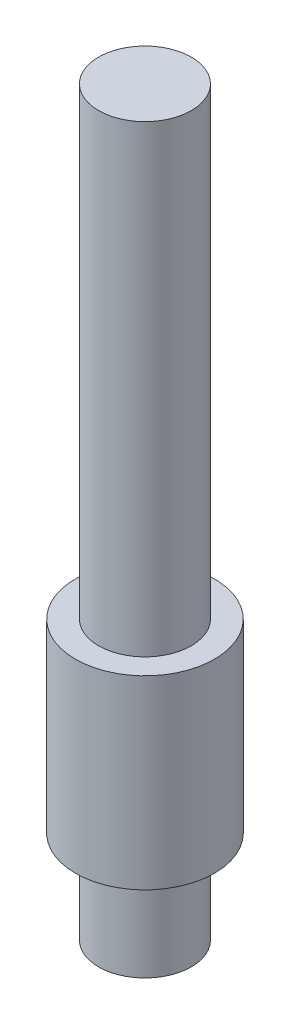
ISO-10303-21;
HEADER;
FILE_DESCRIPTION(('STEP AP214'),'2;1');
FILE_NAME('part.step','',(''),(''),'','','');
FILE_SCHEMA(('AUTOMOTIVE_DESIGN { 1 0 10303 214 1 1 1 1 }'));
ENDSEC;
DATA;
#1=APPLICATION_CONTEXT('core data for automotive mechanical design processes');
#2=APPLICATION_PROTOCOL_DEFINITION('international standard','automotive_design',2000,#1);
#3=PRODUCT_CONTEXT('',#1,'mechanical');
#4=PRODUCT('Part','Part','',(#3));
#5=PRODUCT_RELATED_PRODUCT_CATEGORY('part','',(#4));
#6=PRODUCT_DEFINITION_FORMATION('','',#4);
#7=PRODUCT_DEFINITION_CONTEXT('part definition',#1,'design');
#8=PRODUCT_DEFINITION('design','',#6,#7);
#9=PRODUCT_DEFINITION_SHAPE('','',#8);
#10=(LENGTH_UNIT() NAMED_UNIT(*) SI_UNIT(.MILLI.,.METRE.));
#11=(NAMED_UNIT(*) PLANE_ANGLE_UNIT() SI_UNIT($,.RADIAN.));
#12=(NAMED_UNIT(*) SI_UNIT($,.STERADIAN.) SOLID_ANGLE_UNIT());
#13=UNCERTAINTY_MEASURE_WITH_UNIT(LENGTH_MEASURE(1.E-05),#10,'distance_accuracy_value','');
#14=(GEOMETRIC_REPRESENTATION_CONTEXT(3) GLOBAL_UNCERTAINTY_ASSIGNED_CONTEXT((#13)) GLOBAL_UNIT_ASSIGNED_CONTEXT((#10,
#11,#12)) REPRESENTATION_CONTEXT('',''));
#15=CARTESIAN_POINT('',(0.,0.,0.));
#16=DIRECTION('',(0.,0.,1.));
#17=DIRECTION('',(1.,0.,0.));
#18=AXIS2_PLACEMENT_3D('',#15,#16,#17);
#19=CARTESIAN_POINT('',(15.,60.,0.));
#20=DIRECTION('',(0.,-1.,0.));
#21=DIRECTION('',(0.,0.,-1.));
#22=AXIS2_PLACEMENT_3D('',#19,#20,#21);
#23=PLANE('',#22);
#24=CARTESIAN_POINT('',(0.,60.,0.));
#25=DIRECTION('',(0.,1.,0.));
#26=DIRECTION('',(0.,0.,1.));
#27=AXIS2_PLACEMENT_3D('',#24,#25,#26);
#28=CIRCLE('',#27,10.);
#29=CARTESIAN_POINT('',(0.,60.,10.));
#30=VERTEX_POINT('',#29);
#31=EDGE_CURVE('E52',#30,#30,#28,.T.);
#32=ORIENTED_EDGE('',*,*,#31,.F.);
#33=EDGE_LOOP('',(#32));
#34=FACE_BOUND('',#33,.T.);
#35=CARTESIAN_POINT('',(0.,60.,0.));
#36=DIRECTION('',(0.,1.,0.));
#37=DIRECTION('',(0.,0.,1.));
#38=AXIS2_PLACEMENT_3D('',#35,#36,#37);
#39=CIRCLE('',#38,15.);
#40=CARTESIAN_POINT('',(0.,60.,15.));
#41=VERTEX_POINT('',#40);
#42=EDGE_CURVE('E10',#41,#41,#39,.T.);
#43=ORIENTED_EDGE('',*,*,#42,.T.);
#44=EDGE_LOOP('',(#43));
#45=FACE_BOUND('',#44,.T.);
#46=ADVANCED_FACE('F30',(#34,#45),#23,.F.);
#47=CARTESIAN_POINT('',(0.,39.9879497331727,0.));
#48=DIRECTION('',(0.,1.,0.));
#49=DIRECTION('',(0.,0.,1.));
#50=AXIS2_PLACEMENT_3D('',#47,#48,#49);
#51=CYLINDRICAL_SURFACE('',#50,15.);
#52=ORIENTED_EDGE('',*,*,#42,.F.);
#53=EDGE_LOOP('',(#52));
#54=FACE_BOUND('',#53,.T.);
#55=CARTESIAN_POINT('',(0.,20.,0.));
#56=DIRECTION('',(0.,1.,0.));
#57=DIRECTION('',(0.,0.,1.));
#58=AXIS2_PLACEMENT_3D('',#55,#56,#57);
#59=CIRCLE('',#58,15.);
#60=CARTESIAN_POINT('',(0.,20.,15.));
#61=VERTEX_POINT('',#60);
#62=EDGE_CURVE('E36',#61,#61,#59,.T.);
#63=ORIENTED_EDGE('',*,*,#62,.T.);
#64=EDGE_LOOP('',(#63));
#65=FACE_BOUND('',#64,.T.);
#66=ADVANCED_FACE('F59',(#54,#65),#51,.T.);
#67=CARTESIAN_POINT('',(15.,20.,0.));
#68=DIRECTION('',(0.,1.,0.));
#69=DIRECTION('',(0.,0.,1.));
#70=AXIS2_PLACEMENT_3D('',#67,#68,#69);
#71=PLANE('',#70);
#72=ORIENTED_EDGE('',*,*,#62,.F.);
#73=EDGE_LOOP('',(#72));
#74=FACE_BOUND('',#73,.T.);
#75=CARTESIAN_POINT('',(0.,20.,0.));
#76=DIRECTION('',(0.,1.,0.));
#77=DIRECTION('',(0.,0.,1.));
#78=AXIS2_PLACEMENT_3D('',#75,#76,#77);
#79=CIRCLE('',#78,10.);
#80=CARTESIAN_POINT('',(0.,20.,10.));
#81=VERTEX_POINT('',#80);
#82=EDGE_CURVE('E40',#81,#81,#79,.T.);
#83=ORIENTED_EDGE('',*,*,#82,.T.);
#84=EDGE_LOOP('',(#83));
#85=FACE_BOUND('',#84,.T.);
#86=ADVANCED_FACE('F63',(#74,#85),#71,.F.);
#87=CARTESIAN_POINT('',(0.,39.9879497331727,0.));
#88=DIRECTION('',(0.,1.,0.));
#89=DIRECTION('',(0.,0.,1.));
#90=AXIS2_PLACEMENT_3D('',#87,#88,#89);
#91=CYLINDRICAL_SURFACE('',#90,10.);
#92=ORIENTED_EDGE('',*,*,#82,.F.);
#93=EDGE_LOOP('',(#92));
#94=FACE_BOUND('',#93,.T.);
#95=CARTESIAN_POINT('',(0.,0.,0.));
#96=DIRECTION('',(0.,1.,0.));
#97=DIRECTION('',(0.,0.,1.));
#98=AXIS2_PLACEMENT_3D('',#95,#96,#97);
#99=CIRCLE('',#98,10.);
#100=CARTESIAN_POINT('',(0.,0.,10.));
#101=VERTEX_POINT('',#100);
#102=EDGE_CURVE('E44',#101,#101,#99,.T.);
#103=ORIENTED_EDGE('',*,*,#102,.T.);
#104=EDGE_LOOP('',(#103));
#105=FACE_BOUND('',#104,.T.);
#106=ADVANCED_FACE('F68',(#94,#105),#91,.T.);
#107=CARTESIAN_POINT('',(10.,0.,0.));
#108=DIRECTION('',(0.,1.,0.));
#109=DIRECTION('',(0.,0.,1.));
#110=AXIS2_PLACEMENT_3D('',#107,#108,#109);
#111=PLANE('',#110);
#112=ORIENTED_EDGE('',*,*,#102,.F.);
#113=EDGE_LOOP('',(#112));
#114=FACE_BOUND('',#113,.T.);
#115=ADVANCED_FACE('F74',(#114),#111,.F.);
#116=CARTESIAN_POINT('',(10.,160.,0.));
#117=DIRECTION('',(0.,-1.,0.));
#118=DIRECTION('',(0.,0.,-1.));
#119=AXIS2_PLACEMENT_3D('',#116,#117,#118);
#120=PLANE('',#119);
#121=CARTESIAN_POINT('',(0.,160.,0.));
#122=DIRECTION('',(0.,1.,0.));
#123=DIRECTION('',(0.,0.,1.));
#124=AXIS2_PLACEMENT_3D('',#121,#122,#123);
#125=CIRCLE('',#124,10.);
#126=CARTESIAN_POINT('',(0.,160.,10.));
#127=VERTEX_POINT('',#126);
#128=EDGE_CURVE('E49',#127,#127,#125,.T.);
#129=ORIENTED_EDGE('',*,*,#128,.T.);
#130=EDGE_LOOP('',(#129));
#131=FACE_BOUND('',#130,.T.);
#132=ADVANCED_FACE('F78',(#131),#120,.F.);
#133=CARTESIAN_POINT('',(0.,39.9879497331727,0.));
#134=DIRECTION('',(0.,1.,0.));
#135=DIRECTION('',(0.,0.,1.));
#136=AXIS2_PLACEMENT_3D('',#133,#134,#135);
#137=CYLINDRICAL_SURFACE('',#136,10.);
#138=ORIENTED_EDGE('',*,*,#128,.F.);
#139=EDGE_LOOP('',(#138));
#140=FACE_BOUND('',#139,.T.);
#141=ORIENTED_EDGE('',*,*,#31,.T.);
#142=EDGE_LOOP('',(#141));
#143=FACE_BOUND('',#142,.T.);
#144=ADVANCED_FACE('F56',(#140,#143),#137,.T.);
#145=CLOSED_SHELL('',(#46,#66,#86,#106,#115,#132,#144));
#146=MANIFOLD_SOLID_BREP('B2',#145);
#147=ADVANCED_BREP_SHAPE_REPRESENTATION('',(#18,#146),#14);
#148=SHAPE_DEFINITION_REPRESENTATION(#9,#147);
ENDSEC;
END-ISO-10303-21;
